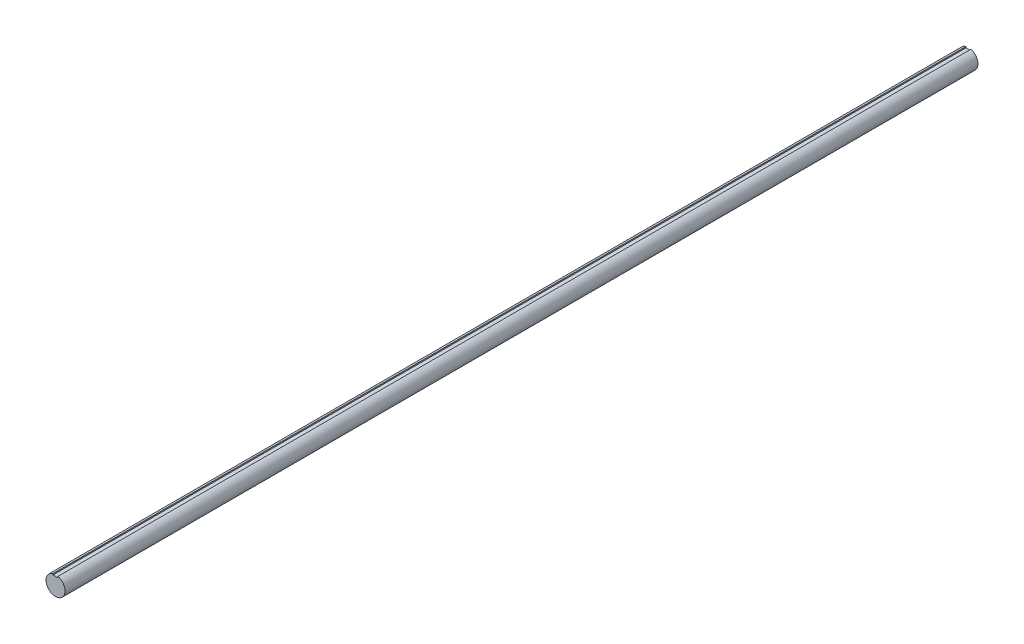
ISO-10303-21;
HEADER;
FILE_DESCRIPTION(('STEP AP214'),'2;1');
FILE_NAME('part.step','',(''),(''),'','','');
FILE_SCHEMA(('AUTOMOTIVE_DESIGN { 1 0 10303 214 1 1 1 1 }'));
ENDSEC;
DATA;
#1=APPLICATION_CONTEXT('core data for automotive mechanical design processes');
#2=APPLICATION_PROTOCOL_DEFINITION('international standard','automotive_design',2000,#1);
#3=PRODUCT_CONTEXT('',#1,'mechanical');
#4=PRODUCT('Part','Part','',(#3));
#5=PRODUCT_RELATED_PRODUCT_CATEGORY('part','',(#4));
#6=PRODUCT_DEFINITION_FORMATION('','',#4);
#7=PRODUCT_DEFINITION_CONTEXT('part definition',#1,'design');
#8=PRODUCT_DEFINITION('design','',#6,#7);
#9=PRODUCT_DEFINITION_SHAPE('','',#8);
#10=(LENGTH_UNIT() NAMED_UNIT(*) SI_UNIT(.MILLI.,.METRE.));
#11=(NAMED_UNIT(*) PLANE_ANGLE_UNIT() SI_UNIT($,.RADIAN.));
#12=(NAMED_UNIT(*) SI_UNIT($,.STERADIAN.) SOLID_ANGLE_UNIT());
#13=UNCERTAINTY_MEASURE_WITH_UNIT(LENGTH_MEASURE(1.E-05),#10,'distance_accuracy_value','');
#14=(GEOMETRIC_REPRESENTATION_CONTEXT(3) GLOBAL_UNCERTAINTY_ASSIGNED_CONTEXT((#13)) GLOBAL_UNIT_ASSIGNED_CONTEXT((#10,
#11,#12)) REPRESENTATION_CONTEXT('',''));
#15=CARTESIAN_POINT('',(0.,0.,0.));
#16=DIRECTION('',(0.,0.,1.));
#17=DIRECTION('',(1.,0.,0.));
#18=AXIS2_PLACEMENT_3D('',#15,#16,#17);
#19=CARTESIAN_POINT('',(1.2192,4.60379817216176,457.2));
#20=DIRECTION('',(1.,0.,0.));
#21=DIRECTION('',(0.,1.,0.));
#22=AXIS2_PLACEMENT_3D('',#19,#20,#21);
#23=PLANE('',#22);
#24=DIRECTION('',(0.,-1.,0.));
#25=VECTOR('',#24,1.);
#26=CARTESIAN_POINT('',(1.2192,4.60379817216176,0.));
#27=LINE('',#26,#25);
#28=CARTESIAN_POINT('',(1.2192,4.60379817216176,0.));
#29=VERTEX_POINT('',#28);
#30=CARTESIAN_POINT('',(1.2192,3.9933413724782,0.));
#31=VERTEX_POINT('',#30);
#32=EDGE_CURVE('E98',#29,#31,#27,.T.);
#33=ORIENTED_EDGE('',*,*,#32,.T.);
#34=DIRECTION('',(0.,0.,-1.));
#35=VECTOR('',#34,1.);
#36=CARTESIAN_POINT('',(1.2192,3.9933413724782,457.2));
#37=LINE('',#36,#35);
#38=CARTESIAN_POINT('',(1.2192,3.9933413724782,457.2));
#39=VERTEX_POINT('',#38);
#40=EDGE_CURVE('E11',#39,#31,#37,.T.);
#41=ORIENTED_EDGE('',*,*,#40,.F.);
#42=DIRECTION('',(0.,-1.,0.));
#43=VECTOR('',#42,1.);
#44=CARTESIAN_POINT('',(1.2192,4.60379817216176,457.2));
#45=LINE('',#44,#43);
#46=CARTESIAN_POINT('',(1.2192,4.60379817216176,457.2));
#47=VERTEX_POINT('',#46);
#48=EDGE_CURVE('E86',#47,#39,#45,.T.);
#49=ORIENTED_EDGE('',*,*,#48,.F.);
#50=DIRECTION('',(0.,0.,-1.));
#51=VECTOR('',#50,1.);
#52=CARTESIAN_POINT('',(1.2192,4.60379817216176,457.2));
#53=LINE('',#52,#51);
#54=EDGE_CURVE('E94',#47,#29,#53,.T.);
#55=ORIENTED_EDGE('',*,*,#54,.T.);
#56=EDGE_LOOP('',(#33,#41,#49,#55));
#57=FACE_BOUND('',#56,.T.);
#58=ADVANCED_FACE('F35',(#57),#23,.F.);
#59=CARTESIAN_POINT('',(-1.2192,3.9933413724782,457.2));
#60=DIRECTION('',(0.,-1.,0.));
#61=DIRECTION('',(0.,0.,-1.));
#62=AXIS2_PLACEMENT_3D('',#59,#60,#61);
#63=PLANE('',#62);
#64=DIRECTION('',(-1.,0.,0.));
#65=VECTOR('',#64,1.);
#66=CARTESIAN_POINT('',(-1.2192,3.9933413724782,0.));
#67=LINE('',#66,#65);
#68=CARTESIAN_POINT('',(-1.2192,3.9933413724782,0.));
#69=VERTEX_POINT('',#68);
#70=EDGE_CURVE('E90',#31,#69,#67,.T.);
#71=ORIENTED_EDGE('',*,*,#70,.T.);
#72=DIRECTION('',(0.,0.,-1.));
#73=VECTOR('',#72,1.);
#74=CARTESIAN_POINT('',(-1.2192,3.9933413724782,457.2));
#75=LINE('',#74,#73);
#76=CARTESIAN_POINT('',(-1.2192,3.9933413724782,457.2));
#77=VERTEX_POINT('',#76);
#78=EDGE_CURVE('E43',#77,#69,#75,.T.);
#79=ORIENTED_EDGE('',*,*,#78,.F.);
#80=DIRECTION('',(-1.,0.,0.));
#81=VECTOR('',#80,1.);
#82=CARTESIAN_POINT('',(-1.2192,3.9933413724782,457.2));
#83=LINE('',#82,#81);
#84=EDGE_CURVE('E81',#39,#77,#83,.T.);
#85=ORIENTED_EDGE('',*,*,#84,.F.);
#86=ORIENTED_EDGE('',*,*,#40,.T.);
#87=EDGE_LOOP('',(#71,#79,#85,#86));
#88=FACE_BOUND('',#87,.T.);
#89=ADVANCED_FACE('F89',(#88),#63,.F.);
#90=CARTESIAN_POINT('',(-1.2192,4.60379817216176,457.2));
#91=DIRECTION('',(-1.,0.,0.));
#92=DIRECTION('',(0.,-1.,0.));
#93=AXIS2_PLACEMENT_3D('',#90,#91,#92);
#94=PLANE('',#93);
#95=DIRECTION('',(0.,1.,0.));
#96=VECTOR('',#95,1.);
#97=CARTESIAN_POINT('',(-1.2192,4.60379817216176,0.));
#98=LINE('',#97,#96);
#99=CARTESIAN_POINT('',(-1.2192,4.60379817216176,0.));
#100=VERTEX_POINT('',#99);
#101=EDGE_CURVE('E68',#69,#100,#98,.T.);
#102=ORIENTED_EDGE('',*,*,#101,.T.);
#103=DIRECTION('',(0.,0.,-1.));
#104=VECTOR('',#103,1.);
#105=CARTESIAN_POINT('',(-1.2192,4.60379817216176,457.2));
#106=LINE('',#105,#104);
#107=CARTESIAN_POINT('',(-1.2192,4.60379817216176,457.2));
#108=VERTEX_POINT('',#107);
#109=EDGE_CURVE('E91',#108,#100,#106,.T.);
#110=ORIENTED_EDGE('',*,*,#109,.F.);
#111=DIRECTION('',(0.,1.,0.));
#112=VECTOR('',#111,1.);
#113=CARTESIAN_POINT('',(-1.2192,4.60379817216176,457.2));
#114=LINE('',#113,#112);
#115=EDGE_CURVE('E84',#77,#108,#114,.T.);
#116=ORIENTED_EDGE('',*,*,#115,.F.);
#117=ORIENTED_EDGE('',*,*,#78,.T.);
#118=EDGE_LOOP('',(#102,#110,#116,#117));
#119=FACE_BOUND('',#118,.T.);
#120=ADVANCED_FACE('F92',(#119),#94,.F.);
#121=CARTESIAN_POINT('',(0.,0.,457.2));
#122=DIRECTION('',(0.,0.,-1.));
#123=DIRECTION('',(-1.,0.,0.));
#124=AXIS2_PLACEMENT_3D('',#121,#122,#123);
#125=CYLINDRICAL_SURFACE('',#124,4.7625);
#126=CARTESIAN_POINT('',(0.,0.,0.));
#127=DIRECTION('',(0.,0.,1.));
#128=DIRECTION('',(1.,0.,0.));
#129=AXIS2_PLACEMENT_3D('',#126,#127,#128);
#130=CIRCLE('',#129,4.7625);
#131=EDGE_CURVE('E74',#100,#29,#130,.T.);
#132=ORIENTED_EDGE('',*,*,#131,.T.);
#133=ORIENTED_EDGE('',*,*,#54,.F.);
#134=CARTESIAN_POINT('',(0.,0.,457.2));
#135=DIRECTION('',(0.,0.,1.));
#136=DIRECTION('',(1.,0.,0.));
#137=AXIS2_PLACEMENT_3D('',#134,#135,#136);
#138=CIRCLE('',#137,4.7625);
#139=EDGE_CURVE('E51',#108,#47,#138,.T.);
#140=ORIENTED_EDGE('',*,*,#139,.F.);
#141=ORIENTED_EDGE('',*,*,#109,.T.);
#142=EDGE_LOOP('',(#132,#133,#140,#141));
#143=FACE_BOUND('',#142,.T.);
#144=ADVANCED_FACE('F105',(#143),#125,.T.);
#145=CARTESIAN_POINT('',(0.,0.,457.2));
#146=DIRECTION('',(0.,0.,1.));
#147=DIRECTION('',(1.,0.,0.));
#148=AXIS2_PLACEMENT_3D('',#145,#146,#147);
#149=PLANE('',#148);
#150=ORIENTED_EDGE('',*,*,#48,.T.);
#151=ORIENTED_EDGE('',*,*,#84,.T.);
#152=ORIENTED_EDGE('',*,*,#115,.T.);
#153=ORIENTED_EDGE('',*,*,#139,.T.);
#154=EDGE_LOOP('',(#150,#151,#152,#153));
#155=FACE_BOUND('',#154,.T.);
#156=ADVANCED_FACE('F82',(#155),#149,.T.);
#157=CARTESIAN_POINT('',(0.,0.,0.));
#158=DIRECTION('',(0.,0.,1.));
#159=DIRECTION('',(1.,0.,0.));
#160=AXIS2_PLACEMENT_3D('',#157,#158,#159);
#161=PLANE('',#160);
#162=ORIENTED_EDGE('',*,*,#32,.F.);
#163=ORIENTED_EDGE('',*,*,#131,.F.);
#164=ORIENTED_EDGE('',*,*,#101,.F.);
#165=ORIENTED_EDGE('',*,*,#70,.F.);
#166=EDGE_LOOP('',(#162,#163,#164,#165));
#167=FACE_BOUND('',#166,.T.);
#168=ADVANCED_FACE('F108',(#167),#161,.F.);
#169=CLOSED_SHELL('',(#58,#89,#120,#144,#156,#168));
#170=MANIFOLD_SOLID_BREP('B2',#169);
#171=ADVANCED_BREP_SHAPE_REPRESENTATION('',(#18,#170),#14);
#172=SHAPE_DEFINITION_REPRESENTATION(#9,#171);
ENDSEC;
END-ISO-10303-21;
